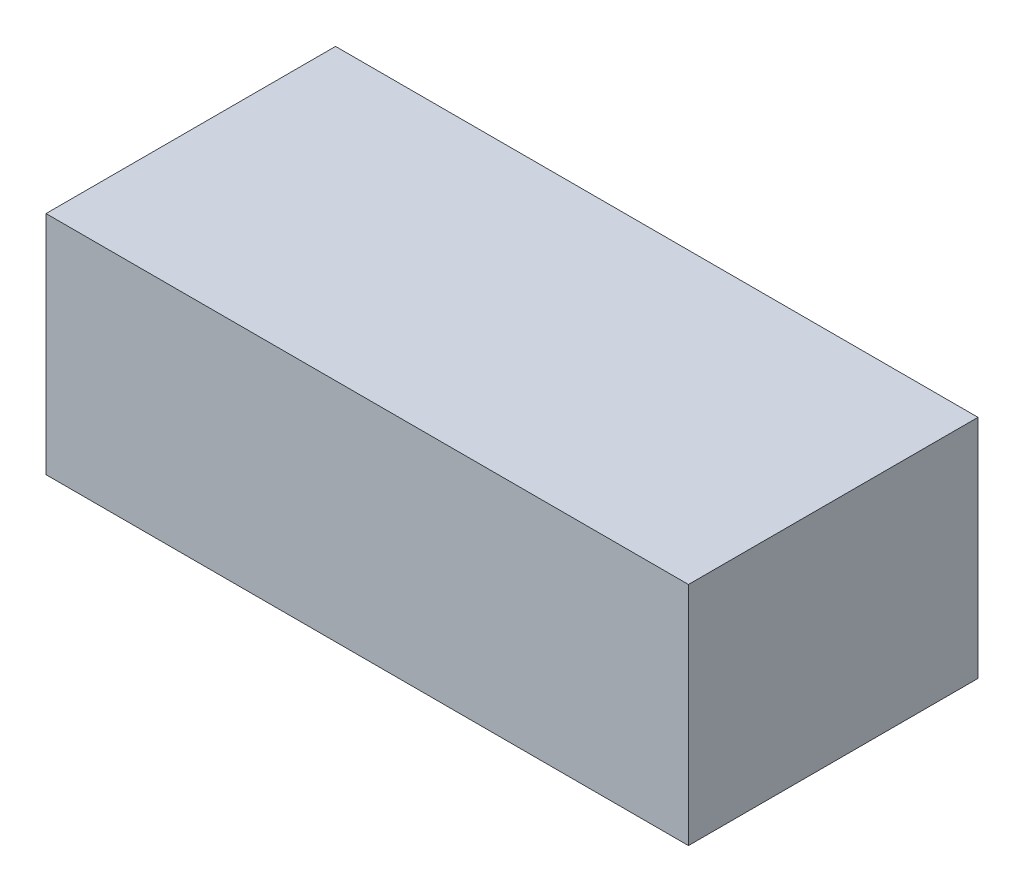
ISO-10303-21;
HEADER;
FILE_DESCRIPTION(('STEP AP214'),'2;1');
FILE_NAME('part.step','',(''),(''),'','','');
FILE_SCHEMA(('AUTOMOTIVE_DESIGN { 1 0 10303 214 1 1 1 1 }'));
ENDSEC;
DATA;
#1=APPLICATION_CONTEXT('core data for automotive mechanical design processes');
#2=APPLICATION_PROTOCOL_DEFINITION('international standard','automotive_design',2000,#1);
#3=PRODUCT_CONTEXT('',#1,'mechanical');
#4=PRODUCT('Part','Part','',(#3));
#5=PRODUCT_RELATED_PRODUCT_CATEGORY('part','',(#4));
#6=PRODUCT_DEFINITION_FORMATION('','',#4);
#7=PRODUCT_DEFINITION_CONTEXT('part definition',#1,'design');
#8=PRODUCT_DEFINITION('design','',#6,#7);
#9=PRODUCT_DEFINITION_SHAPE('','',#8);
#10=(LENGTH_UNIT() NAMED_UNIT(*) SI_UNIT(.MILLI.,.METRE.));
#11=(NAMED_UNIT(*) PLANE_ANGLE_UNIT() SI_UNIT($,.RADIAN.));
#12=(NAMED_UNIT(*) SI_UNIT($,.STERADIAN.) SOLID_ANGLE_UNIT());
#13=UNCERTAINTY_MEASURE_WITH_UNIT(LENGTH_MEASURE(1.E-05),#10,'distance_accuracy_value','');
#14=(GEOMETRIC_REPRESENTATION_CONTEXT(3) GLOBAL_UNCERTAINTY_ASSIGNED_CONTEXT((#13)) GLOBAL_UNIT_ASSIGNED_CONTEXT((#10,
#11,#12)) REPRESENTATION_CONTEXT('',''));
#15=CARTESIAN_POINT('',(0.,0.,0.));
#16=DIRECTION('',(0.,0.,1.));
#17=DIRECTION('',(1.,0.,0.));
#18=AXIS2_PLACEMENT_3D('',#15,#16,#17);
#19=CARTESIAN_POINT('',(75.,13.2,16.9));
#20=DIRECTION('',(0.,0.,-1.));
#21=DIRECTION('',(-1.,0.,0.));
#22=AXIS2_PLACEMENT_3D('',#19,#20,#21);
#23=PLANE('',#22);
#24=DIRECTION('',(0.,-1.,0.));
#25=VECTOR('',#24,1.);
#26=CARTESIAN_POINT('',(0.,13.2,16.9));
#27=LINE('',#26,#25);
#28=CARTESIAN_POINT('',(0.,13.2,16.9));
#29=VERTEX_POINT('',#28);
#30=CARTESIAN_POINT('',(0.,-13.2,16.9));
#31=VERTEX_POINT('',#30);
#32=EDGE_CURVE('E102',#29,#31,#27,.T.);
#33=ORIENTED_EDGE('',*,*,#32,.T.);
#34=DIRECTION('',(-1.,0.,0.));
#35=VECTOR('',#34,1.);
#36=CARTESIAN_POINT('',(75.,-13.2,16.9));
#37=LINE('',#36,#35);
#38=CARTESIAN_POINT('',(75.,-13.2,16.9));
#39=VERTEX_POINT('',#38);
#40=EDGE_CURVE('E11',#39,#31,#37,.T.);
#41=ORIENTED_EDGE('',*,*,#40,.F.);
#42=DIRECTION('',(0.,-1.,0.));
#43=VECTOR('',#42,1.);
#44=CARTESIAN_POINT('',(75.,13.2,16.9));
#45=LINE('',#44,#43);
#46=CARTESIAN_POINT('',(75.,13.2,16.9));
#47=VERTEX_POINT('',#46);
#48=EDGE_CURVE('E90',#47,#39,#45,.T.);
#49=ORIENTED_EDGE('',*,*,#48,.F.);
#50=DIRECTION('',(-1.,0.,0.));
#51=VECTOR('',#50,1.);
#52=CARTESIAN_POINT('',(75.,13.2,16.9));
#53=LINE('',#52,#51);
#54=EDGE_CURVE('E98',#47,#29,#53,.T.);
#55=ORIENTED_EDGE('',*,*,#54,.T.);
#56=EDGE_LOOP('',(#33,#41,#49,#55));
#57=FACE_BOUND('',#56,.T.);
#58=ADVANCED_FACE('F39',(#57),#23,.F.);
#59=CARTESIAN_POINT('',(75.,-13.2,16.9));
#60=DIRECTION('',(0.,1.,0.));
#61=DIRECTION('',(0.,0.,1.));
#62=AXIS2_PLACEMENT_3D('',#59,#60,#61);
#63=PLANE('',#62);
#64=DIRECTION('',(0.,0.,-1.));
#65=VECTOR('',#64,1.);
#66=CARTESIAN_POINT('',(0.,-13.2,16.9));
#67=LINE('',#66,#65);
#68=CARTESIAN_POINT('',(0.,-13.2,-16.9));
#69=VERTEX_POINT('',#68);
#70=EDGE_CURVE('E94',#31,#69,#67,.T.);
#71=ORIENTED_EDGE('',*,*,#70,.T.);
#72=DIRECTION('',(-1.,0.,0.));
#73=VECTOR('',#72,1.);
#74=CARTESIAN_POINT('',(75.,-13.2,-16.9));
#75=LINE('',#74,#73);
#76=CARTESIAN_POINT('',(75.,-13.2,-16.9));
#77=VERTEX_POINT('',#76);
#78=EDGE_CURVE('E47',#77,#69,#75,.T.);
#79=ORIENTED_EDGE('',*,*,#78,.F.);
#80=DIRECTION('',(0.,0.,-1.));
#81=VECTOR('',#80,1.);
#82=CARTESIAN_POINT('',(75.,-13.2,16.9));
#83=LINE('',#82,#81);
#84=EDGE_CURVE('E85',#39,#77,#83,.T.);
#85=ORIENTED_EDGE('',*,*,#84,.F.);
#86=ORIENTED_EDGE('',*,*,#40,.T.);
#87=EDGE_LOOP('',(#71,#79,#85,#86));
#88=FACE_BOUND('',#87,.T.);
#89=ADVANCED_FACE('F93',(#88),#63,.F.);
#90=CARTESIAN_POINT('',(75.,13.2,-16.9));
#91=DIRECTION('',(0.,0.,1.));
#92=DIRECTION('',(1.,0.,0.));
#93=AXIS2_PLACEMENT_3D('',#90,#91,#92);
#94=PLANE('',#93);
#95=DIRECTION('',(0.,1.,0.));
#96=VECTOR('',#95,1.);
#97=CARTESIAN_POINT('',(0.,13.2,-16.9));
#98=LINE('',#97,#96);
#99=CARTESIAN_POINT('',(0.,13.2,-16.9));
#100=VERTEX_POINT('',#99);
#101=EDGE_CURVE('E72',#69,#100,#98,.T.);
#102=ORIENTED_EDGE('',*,*,#101,.T.);
#103=DIRECTION('',(-1.,0.,0.));
#104=VECTOR('',#103,1.);
#105=CARTESIAN_POINT('',(75.,13.2,-16.9));
#106=LINE('',#105,#104);
#107=CARTESIAN_POINT('',(75.,13.2,-16.9));
#108=VERTEX_POINT('',#107);
#109=EDGE_CURVE('E95',#108,#100,#106,.T.);
#110=ORIENTED_EDGE('',*,*,#109,.F.);
#111=DIRECTION('',(0.,1.,0.));
#112=VECTOR('',#111,1.);
#113=CARTESIAN_POINT('',(75.,13.2,-16.9));
#114=LINE('',#113,#112);
#115=EDGE_CURVE('E88',#77,#108,#114,.T.);
#116=ORIENTED_EDGE('',*,*,#115,.F.);
#117=ORIENTED_EDGE('',*,*,#78,.T.);
#118=EDGE_LOOP('',(#102,#110,#116,#117));
#119=FACE_BOUND('',#118,.T.);
#120=ADVANCED_FACE('F96',(#119),#94,.F.);
#121=CARTESIAN_POINT('',(75.,13.2,16.9));
#122=DIRECTION('',(0.,-1.,0.));
#123=DIRECTION('',(0.,0.,-1.));
#124=AXIS2_PLACEMENT_3D('',#121,#122,#123);
#125=PLANE('',#124);
#126=DIRECTION('',(0.,0.,1.));
#127=VECTOR('',#126,1.);
#128=CARTESIAN_POINT('',(0.,13.2,16.9));
#129=LINE('',#128,#127);
#130=EDGE_CURVE('E78',#100,#29,#129,.T.);
#131=ORIENTED_EDGE('',*,*,#130,.T.);
#132=ORIENTED_EDGE('',*,*,#54,.F.);
#133=DIRECTION('',(0.,0.,1.));
#134=VECTOR('',#133,1.);
#135=CARTESIAN_POINT('',(75.,13.2,16.9));
#136=LINE('',#135,#134);
#137=EDGE_CURVE('E55',#108,#47,#136,.T.);
#138=ORIENTED_EDGE('',*,*,#137,.F.);
#139=ORIENTED_EDGE('',*,*,#109,.T.);
#140=EDGE_LOOP('',(#131,#132,#138,#139));
#141=FACE_BOUND('',#140,.T.);
#142=ADVANCED_FACE('F109',(#141),#125,.F.);
#143=CARTESIAN_POINT('',(75.,0.,0.));
#144=DIRECTION('',(1.,0.,0.));
#145=DIRECTION('',(0.,0.,-1.));
#146=AXIS2_PLACEMENT_3D('',#143,#144,#145);
#147=PLANE('',#146);
#148=ORIENTED_EDGE('',*,*,#48,.T.);
#149=ORIENTED_EDGE('',*,*,#84,.T.);
#150=ORIENTED_EDGE('',*,*,#115,.T.);
#151=ORIENTED_EDGE('',*,*,#137,.T.);
#152=EDGE_LOOP('',(#148,#149,#150,#151));
#153=FACE_BOUND('',#152,.T.);
#154=ADVANCED_FACE('F86',(#153),#147,.T.);
#155=CARTESIAN_POINT('',(0.,0.,0.));
#156=DIRECTION('',(1.,0.,0.));
#157=DIRECTION('',(0.,0.,-1.));
#158=AXIS2_PLACEMENT_3D('',#155,#156,#157);
#159=PLANE('',#158);
#160=ORIENTED_EDGE('',*,*,#32,.F.);
#161=ORIENTED_EDGE('',*,*,#130,.F.);
#162=ORIENTED_EDGE('',*,*,#101,.F.);
#163=ORIENTED_EDGE('',*,*,#70,.F.);
#164=EDGE_LOOP('',(#160,#161,#162,#163));
#165=FACE_BOUND('',#164,.T.);
#166=ADVANCED_FACE('F112',(#165),#159,.F.);
#167=CLOSED_SHELL('',(#58,#89,#120,#142,#154,#166));
#168=MANIFOLD_SOLID_BREP('B2',#167);
#169=ADVANCED_BREP_SHAPE_REPRESENTATION('',(#18,#168),#14);
#170=SHAPE_DEFINITION_REPRESENTATION(#9,#169);
ENDSEC;
END-ISO-10303-21;
